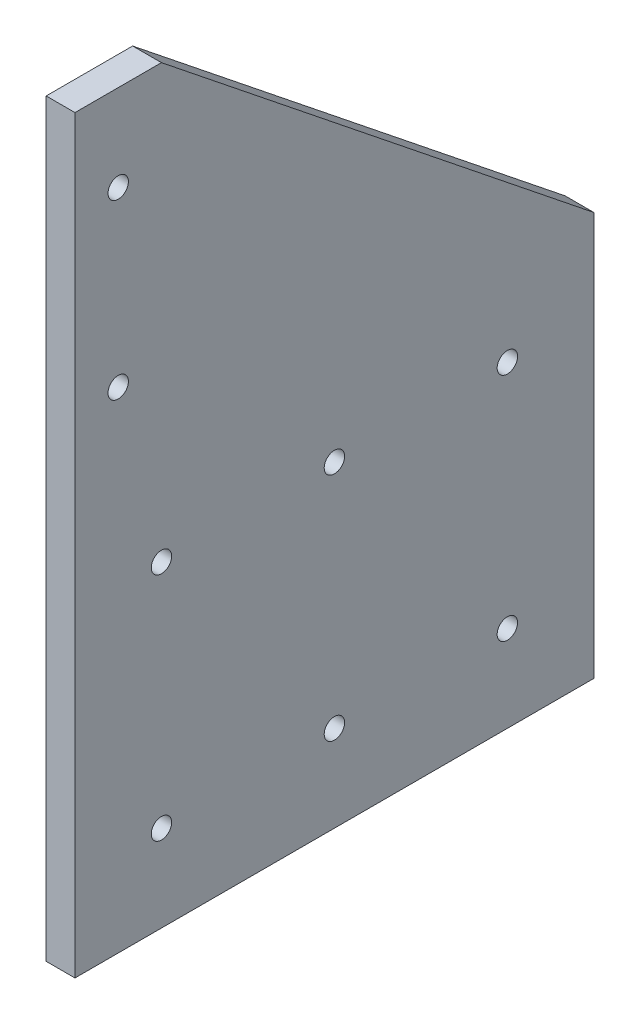
ISO-10303-21;
HEADER;
FILE_DESCRIPTION(('STEP AP214'),'2;1');
FILE_NAME('part.step','',(''),(''),'','','');
FILE_SCHEMA(('AUTOMOTIVE_DESIGN { 1 0 10303 214 1 1 1 1 }'));
ENDSEC;
DATA;
#1=APPLICATION_CONTEXT('core data for automotive mechanical design processes');
#2=APPLICATION_PROTOCOL_DEFINITION('international standard','automotive_design',2000,#1);
#3=PRODUCT_CONTEXT('',#1,'mechanical');
#4=PRODUCT('Part','Part','',(#3));
#5=PRODUCT_RELATED_PRODUCT_CATEGORY('part','',(#4));
#6=PRODUCT_DEFINITION_FORMATION('','',#4);
#7=PRODUCT_DEFINITION_CONTEXT('part definition',#1,'design');
#8=PRODUCT_DEFINITION('design','',#6,#7);
#9=PRODUCT_DEFINITION_SHAPE('','',#8);
#10=(LENGTH_UNIT() NAMED_UNIT(*) SI_UNIT(.MILLI.,.METRE.));
#11=(NAMED_UNIT(*) PLANE_ANGLE_UNIT() SI_UNIT($,.RADIAN.));
#12=(NAMED_UNIT(*) SI_UNIT($,.STERADIAN.) SOLID_ANGLE_UNIT());
#13=UNCERTAINTY_MEASURE_WITH_UNIT(LENGTH_MEASURE(1.E-05),#10,'distance_accuracy_value','');
#14=(GEOMETRIC_REPRESENTATION_CONTEXT(3) GLOBAL_UNCERTAINTY_ASSIGNED_CONTEXT((#13)) GLOBAL_UNIT_ASSIGNED_CONTEXT((#10,
#11,#12)) REPRESENTATION_CONTEXT('',''));
#15=CARTESIAN_POINT('',(0.,0.,0.));
#16=DIRECTION('',(0.,0.,1.));
#17=DIRECTION('',(1.,0.,0.));
#18=AXIS2_PLACEMENT_3D('',#15,#16,#17);
#19=CARTESIAN_POINT('',(6.477,38.1,393.7));
#20=DIRECTION('',(0.,-1.,0.));
#21=DIRECTION('',(0.,0.,-1.));
#22=AXIS2_PLACEMENT_3D('',#19,#20,#21);
#23=PLANE('',#22);
#24=DIRECTION('',(0.,0.,-1.));
#25=VECTOR('',#24,1.);
#26=CARTESIAN_POINT('',(12.827,38.1,393.7));
#27=LINE('',#26,#25);
#28=CARTESIAN_POINT('',(12.827,38.1,412.75));
#29=VERTEX_POINT('',#28);
#30=CARTESIAN_POINT('',(12.827,38.1,393.7));
#31=VERTEX_POINT('',#30);
#32=EDGE_CURVE('E112',#29,#31,#27,.T.);
#33=ORIENTED_EDGE('',*,*,#32,.T.);
#34=DIRECTION('',(1.,0.,0.));
#35=VECTOR('',#34,1.);
#36=CARTESIAN_POINT('',(6.477,38.1,393.7));
#37=LINE('',#36,#35);
#38=CARTESIAN_POINT('',(6.477,38.1,393.7));
#39=VERTEX_POINT('',#38);
#40=EDGE_CURVE('E11',#39,#31,#37,.T.);
#41=ORIENTED_EDGE('',*,*,#40,.F.);
#42=DIRECTION('',(0.,0.,-1.));
#43=VECTOR('',#42,1.);
#44=CARTESIAN_POINT('',(6.477,38.1,393.7));
#45=LINE('',#44,#43);
#46=CARTESIAN_POINT('',(6.477,38.1,412.75));
#47=VERTEX_POINT('',#46);
#48=EDGE_CURVE('E121',#47,#39,#45,.T.);
#49=ORIENTED_EDGE('',*,*,#48,.F.);
#50=DIRECTION('',(1.,0.,0.));
#51=VECTOR('',#50,1.);
#52=CARTESIAN_POINT('',(6.477,38.1,412.75));
#53=LINE('',#52,#51);
#54=EDGE_CURVE('E108',#47,#29,#53,.T.);
#55=ORIENTED_EDGE('',*,*,#54,.T.);
#56=EDGE_LOOP('',(#33,#41,#49,#55));
#57=FACE_BOUND('',#56,.T.);
#58=ADVANCED_FACE('F36',(#57),#23,.F.);
#59=CARTESIAN_POINT('',(6.477,-38.1,298.45));
#60=DIRECTION('',(0.,-0.78086880944303,0.624695047554424));
#61=DIRECTION('',(0.,-0.624695047554424,-0.78086880944303));
#62=AXIS2_PLACEMENT_3D('',#59,#60,#61);
#63=PLANE('',#62);
#64=DIRECTION('',(0.,-0.624695047554424,-0.78086880944303));
#65=VECTOR('',#64,1.);
#66=CARTESIAN_POINT('',(12.827,-38.1,298.45));
#67=LINE('',#66,#65);
#68=CARTESIAN_POINT('',(12.827,-38.1,298.45));
#69=VERTEX_POINT('',#68);
#70=EDGE_CURVE('E115',#31,#69,#67,.T.);
#71=ORIENTED_EDGE('',*,*,#70,.T.);
#72=DIRECTION('',(1.,0.,0.));
#73=VECTOR('',#72,1.);
#74=CARTESIAN_POINT('',(6.477,-38.1,298.45));
#75=LINE('',#74,#73);
#76=CARTESIAN_POINT('',(6.477,-38.1,298.45));
#77=VERTEX_POINT('',#76);
#78=EDGE_CURVE('E45',#77,#69,#75,.T.);
#79=ORIENTED_EDGE('',*,*,#78,.F.);
#80=DIRECTION('',(0.,-0.624695047554424,-0.78086880944303));
#81=VECTOR('',#80,1.);
#82=CARTESIAN_POINT('',(6.477,-38.1,298.45));
#83=LINE('',#82,#81);
#84=EDGE_CURVE('E88',#39,#77,#83,.T.);
#85=ORIENTED_EDGE('',*,*,#84,.F.);
#86=ORIENTED_EDGE('',*,*,#40,.T.);
#87=EDGE_LOOP('',(#71,#79,#85,#86));
#88=FACE_BOUND('',#87,.T.);
#89=ADVANCED_FACE('F195',(#88),#63,.F.);
#90=CARTESIAN_POINT('',(6.477,-127.,298.45));
#91=DIRECTION('',(0.,0.,1.));
#92=DIRECTION('',(1.,0.,0.));
#93=AXIS2_PLACEMENT_3D('',#90,#91,#92);
#94=PLANE('',#93);
#95=DIRECTION('',(0.,-1.,0.));
#96=VECTOR('',#95,1.);
#97=CARTESIAN_POINT('',(12.827,-127.,298.45));
#98=LINE('',#97,#96);
#99=CARTESIAN_POINT('',(12.827,-127.,298.45));
#100=VERTEX_POINT('',#99);
#101=EDGE_CURVE('E103',#69,#100,#98,.T.);
#102=ORIENTED_EDGE('',*,*,#101,.T.);
#103=DIRECTION('',(1.,0.,0.));
#104=VECTOR('',#103,1.);
#105=CARTESIAN_POINT('',(6.477,-127.,298.45));
#106=LINE('',#105,#104);
#107=CARTESIAN_POINT('',(6.477,-127.,298.45));
#108=VERTEX_POINT('',#107);
#109=EDGE_CURVE('E100',#108,#100,#106,.T.);
#110=ORIENTED_EDGE('',*,*,#109,.F.);
#111=DIRECTION('',(0.,-1.,0.));
#112=VECTOR('',#111,1.);
#113=CARTESIAN_POINT('',(6.477,-127.,298.45));
#114=LINE('',#113,#112);
#115=EDGE_CURVE('E92',#77,#108,#114,.T.);
#116=ORIENTED_EDGE('',*,*,#115,.F.);
#117=ORIENTED_EDGE('',*,*,#78,.T.);
#118=EDGE_LOOP('',(#102,#110,#116,#117));
#119=FACE_BOUND('',#118,.T.);
#120=ADVANCED_FACE('F101',(#119),#94,.F.);
#121=CARTESIAN_POINT('',(6.477,-127.,412.75));
#122=DIRECTION('',(0.,1.,0.));
#123=DIRECTION('',(0.,0.,1.));
#124=AXIS2_PLACEMENT_3D('',#121,#122,#123);
#125=PLANE('',#124);
#126=DIRECTION('',(0.,0.,1.));
#127=VECTOR('',#126,1.);
#128=CARTESIAN_POINT('',(12.827,-127.,412.75));
#129=LINE('',#128,#127);
#130=CARTESIAN_POINT('',(12.827,-127.,412.75));
#131=VERTEX_POINT('',#130);
#132=EDGE_CURVE('E74',#100,#131,#129,.T.);
#133=ORIENTED_EDGE('',*,*,#132,.T.);
#134=DIRECTION('',(1.,0.,0.));
#135=VECTOR('',#134,1.);
#136=CARTESIAN_POINT('',(6.477,-127.,412.75));
#137=LINE('',#136,#135);
#138=CARTESIAN_POINT('',(6.477,-127.,412.75));
#139=VERTEX_POINT('',#138);
#140=EDGE_CURVE('E104',#139,#131,#137,.T.);
#141=ORIENTED_EDGE('',*,*,#140,.F.);
#142=DIRECTION('',(0.,0.,1.));
#143=VECTOR('',#142,1.);
#144=CARTESIAN_POINT('',(6.477,-127.,412.75));
#145=LINE('',#144,#143);
#146=EDGE_CURVE('E96',#108,#139,#145,.T.);
#147=ORIENTED_EDGE('',*,*,#146,.F.);
#148=ORIENTED_EDGE('',*,*,#109,.T.);
#149=EDGE_LOOP('',(#133,#141,#147,#148));
#150=FACE_BOUND('',#149,.T.);
#151=ADVANCED_FACE('F106',(#150),#125,.F.);
#152=CARTESIAN_POINT('',(6.477,38.1,412.75));
#153=DIRECTION('',(0.,0.,-1.));
#154=DIRECTION('',(-1.,0.,0.));
#155=AXIS2_PLACEMENT_3D('',#152,#153,#154);
#156=PLANE('',#155);
#157=DIRECTION('',(0.,1.,0.));
#158=VECTOR('',#157,1.);
#159=CARTESIAN_POINT('',(12.827,38.1,412.75));
#160=LINE('',#159,#158);
#161=EDGE_CURVE('E80',#131,#29,#160,.T.);
#162=ORIENTED_EDGE('',*,*,#161,.T.);
#163=ORIENTED_EDGE('',*,*,#54,.F.);
#164=DIRECTION('',(0.,1.,0.));
#165=VECTOR('',#164,1.);
#166=CARTESIAN_POINT('',(6.477,38.1,412.75));
#167=LINE('',#166,#165);
#168=EDGE_CURVE('E54',#139,#47,#167,.T.);
#169=ORIENTED_EDGE('',*,*,#168,.F.);
#170=ORIENTED_EDGE('',*,*,#140,.T.);
#171=EDGE_LOOP('',(#162,#163,#169,#170));
#172=FACE_BOUND('',#171,.T.);
#173=ADVANCED_FACE('F209',(#172),#156,.F.);
#174=CARTESIAN_POINT('',(6.477,0.,0.));
#175=DIRECTION('',(1.,0.,0.));
#176=DIRECTION('',(0.,0.,-1.));
#177=AXIS2_PLACEMENT_3D('',#174,#175,#176);
#178=PLANE('',#177);
#179=CARTESIAN_POINT('',(6.477,19.05,403.225));
#180=DIRECTION('',(-1.,0.,0.));
#181=DIRECTION('',(0.,0.,1.));
#182=AXIS2_PLACEMENT_3D('',#179,#180,#181);
#183=CIRCLE('',#182,4.2164);
#184=CARTESIAN_POINT('',(6.477,19.05,407.4414));
#185=VERTEX_POINT('',#184);
#186=EDGE_CURVE('E404',#185,#185,#183,.T.);
#187=ORIENTED_EDGE('',*,*,#186,.F.);
#188=EDGE_LOOP('',(#187));
#189=FACE_BOUND('',#188,.T.);
#190=CARTESIAN_POINT('',(6.477,-19.05,403.225));
#191=DIRECTION('',(-1.,0.,0.));
#192=DIRECTION('',(0.,0.,1.));
#193=AXIS2_PLACEMENT_3D('',#190,#191,#192);
#194=CIRCLE('',#193,4.2164);
#195=CARTESIAN_POINT('',(6.477,-19.05,407.4414));
#196=VERTEX_POINT('',#195);
#197=EDGE_CURVE('E161',#196,#196,#194,.T.);
#198=ORIENTED_EDGE('',*,*,#197,.F.);
#199=EDGE_LOOP('',(#198));
#200=FACE_BOUND('',#199,.T.);
#201=CARTESIAN_POINT('',(6.477,-57.15,393.7));
#202=DIRECTION('',(-1.,0.,0.));
#203=DIRECTION('',(0.,0.,1.));
#204=AXIS2_PLACEMENT_3D('',#201,#202,#203);
#205=CIRCLE('',#204,4.2164);
#206=CARTESIAN_POINT('',(6.477,-57.15,397.9164));
#207=VERTEX_POINT('',#206);
#208=EDGE_CURVE('E154',#207,#207,#205,.T.);
#209=ORIENTED_EDGE('',*,*,#208,.F.);
#210=EDGE_LOOP('',(#209));
#211=FACE_BOUND('',#210,.T.);
#212=CARTESIAN_POINT('',(6.477,-107.95,393.7));
#213=DIRECTION('',(-1.,0.,0.));
#214=DIRECTION('',(0.,0.,1.));
#215=AXIS2_PLACEMENT_3D('',#212,#213,#214);
#216=CIRCLE('',#215,4.21639999999999);
#217=CARTESIAN_POINT('',(6.477,-107.95,397.9164));
#218=VERTEX_POINT('',#217);
#219=EDGE_CURVE('E150',#218,#218,#216,.T.);
#220=ORIENTED_EDGE('',*,*,#219,.F.);
#221=EDGE_LOOP('',(#220));
#222=FACE_BOUND('',#221,.T.);
#223=CARTESIAN_POINT('',(6.477,-107.95,355.6));
#224=DIRECTION('',(-1.,0.,0.));
#225=DIRECTION('',(0.,0.,1.));
#226=AXIS2_PLACEMENT_3D('',#223,#224,#225);
#227=CIRCLE('',#226,4.21639999999999);
#228=CARTESIAN_POINT('',(6.477,-107.95,359.8164));
#229=VERTEX_POINT('',#228);
#230=EDGE_CURVE('E146',#229,#229,#227,.T.);
#231=ORIENTED_EDGE('',*,*,#230,.F.);
#232=EDGE_LOOP('',(#231));
#233=FACE_BOUND('',#232,.T.);
#234=CARTESIAN_POINT('',(6.477,-57.15,355.6));
#235=DIRECTION('',(-1.,0.,0.));
#236=DIRECTION('',(0.,0.,1.));
#237=AXIS2_PLACEMENT_3D('',#234,#235,#236);
#238=CIRCLE('',#237,4.2164);
#239=CARTESIAN_POINT('',(6.477,-57.15,359.8164));
#240=VERTEX_POINT('',#239);
#241=EDGE_CURVE('E141',#240,#240,#238,.T.);
#242=ORIENTED_EDGE('',*,*,#241,.F.);
#243=EDGE_LOOP('',(#242));
#244=FACE_BOUND('',#243,.T.);
#245=CARTESIAN_POINT('',(6.477,-57.15,317.5));
#246=DIRECTION('',(-1.,0.,0.));
#247=DIRECTION('',(0.,0.,1.));
#248=AXIS2_PLACEMENT_3D('',#245,#246,#247);
#249=CIRCLE('',#248,4.2164);
#250=CARTESIAN_POINT('',(6.477,-57.15,321.7164));
#251=VERTEX_POINT('',#250);
#252=EDGE_CURVE('E136',#251,#251,#249,.T.);
#253=ORIENTED_EDGE('',*,*,#252,.F.);
#254=EDGE_LOOP('',(#253));
#255=FACE_BOUND('',#254,.T.);
#256=CARTESIAN_POINT('',(6.477,-107.95,317.5));
#257=DIRECTION('',(-1.,0.,0.));
#258=DIRECTION('',(0.,0.,1.));
#259=AXIS2_PLACEMENT_3D('',#256,#257,#258);
#260=CIRCLE('',#259,4.21639999999999);
#261=CARTESIAN_POINT('',(6.477,-107.95,321.7164));
#262=VERTEX_POINT('',#261);
#263=EDGE_CURVE('E131',#262,#262,#260,.T.);
#264=ORIENTED_EDGE('',*,*,#263,.F.);
#265=EDGE_LOOP('',(#264));
#266=FACE_BOUND('',#265,.T.);
#267=ORIENTED_EDGE('',*,*,#48,.T.);
#268=ORIENTED_EDGE('',*,*,#84,.T.);
#269=ORIENTED_EDGE('',*,*,#115,.T.);
#270=ORIENTED_EDGE('',*,*,#146,.T.);
#271=ORIENTED_EDGE('',*,*,#168,.T.);
#272=EDGE_LOOP('',(#267,#268,#269,#270,#271));
#273=FACE_BOUND('',#272,.T.);
#274=ADVANCED_FACE('F94',(#189,#200,#211,#222,#233,#244,#255,#266,#273),#178,.F.);
#275=CARTESIAN_POINT('',(12.827,0.,0.));
#276=DIRECTION('',(1.,0.,0.));
#277=DIRECTION('',(0.,0.,-1.));
#278=AXIS2_PLACEMENT_3D('',#275,#276,#277);
#279=PLANE('',#278);
#280=CARTESIAN_POINT('',(12.827,19.05,403.225));
#281=DIRECTION('',(1.,0.,0.));
#282=DIRECTION('',(0.,0.,-1.));
#283=AXIS2_PLACEMENT_3D('',#280,#281,#282);
#284=CIRCLE('',#283,2.2479);
#285=CARTESIAN_POINT('',(12.827,19.05,400.9771));
#286=VERTEX_POINT('',#285);
#287=EDGE_CURVE('E39',#286,#286,#284,.T.);
#288=ORIENTED_EDGE('',*,*,#287,.F.);
#289=EDGE_LOOP('',(#288));
#290=FACE_BOUND('',#289,.T.);
#291=CARTESIAN_POINT('',(12.827,-19.05,403.225));
#292=DIRECTION('',(1.,0.,0.));
#293=DIRECTION('',(0.,0.,-1.));
#294=AXIS2_PLACEMENT_3D('',#291,#292,#293);
#295=CIRCLE('',#294,2.2479);
#296=CARTESIAN_POINT('',(12.827,-19.05,400.9771));
#297=VERTEX_POINT('',#296);
#298=EDGE_CURVE('E152',#297,#297,#295,.T.);
#299=ORIENTED_EDGE('',*,*,#298,.F.);
#300=EDGE_LOOP('',(#299));
#301=FACE_BOUND('',#300,.T.);
#302=CARTESIAN_POINT('',(12.827,-57.15,393.7));
#303=DIRECTION('',(1.,0.,0.));
#304=DIRECTION('',(0.,0.,-1.));
#305=AXIS2_PLACEMENT_3D('',#302,#303,#304);
#306=CIRCLE('',#305,2.2479);
#307=CARTESIAN_POINT('',(12.827,-57.15,391.4521));
#308=VERTEX_POINT('',#307);
#309=EDGE_CURVE('E148',#308,#308,#306,.T.);
#310=ORIENTED_EDGE('',*,*,#309,.F.);
#311=EDGE_LOOP('',(#310));
#312=FACE_BOUND('',#311,.T.);
#313=CARTESIAN_POINT('',(12.827,-107.95,393.7));
#314=DIRECTION('',(1.,0.,0.));
#315=DIRECTION('',(0.,0.,-1.));
#316=AXIS2_PLACEMENT_3D('',#313,#314,#315);
#317=CIRCLE('',#316,2.2479);
#318=CARTESIAN_POINT('',(12.827,-107.95,391.4521));
#319=VERTEX_POINT('',#318);
#320=EDGE_CURVE('E143',#319,#319,#317,.T.);
#321=ORIENTED_EDGE('',*,*,#320,.F.);
#322=EDGE_LOOP('',(#321));
#323=FACE_BOUND('',#322,.T.);
#324=CARTESIAN_POINT('',(12.827,-107.95,355.6));
#325=DIRECTION('',(1.,0.,0.));
#326=DIRECTION('',(0.,0.,-1.));
#327=AXIS2_PLACEMENT_3D('',#324,#325,#326);
#328=CIRCLE('',#327,2.2479);
#329=CARTESIAN_POINT('',(12.827,-107.95,353.3521));
#330=VERTEX_POINT('',#329);
#331=EDGE_CURVE('E138',#330,#330,#328,.T.);
#332=ORIENTED_EDGE('',*,*,#331,.F.);
#333=EDGE_LOOP('',(#332));
#334=FACE_BOUND('',#333,.T.);
#335=CARTESIAN_POINT('',(12.827,-57.15,355.6));
#336=DIRECTION('',(1.,0.,0.));
#337=DIRECTION('',(0.,0.,-1.));
#338=AXIS2_PLACEMENT_3D('',#335,#336,#337);
#339=CIRCLE('',#338,2.2479);
#340=CARTESIAN_POINT('',(12.827,-57.15,353.3521));
#341=VERTEX_POINT('',#340);
#342=EDGE_CURVE('E133',#341,#341,#339,.T.);
#343=ORIENTED_EDGE('',*,*,#342,.F.);
#344=EDGE_LOOP('',(#343));
#345=FACE_BOUND('',#344,.T.);
#346=CARTESIAN_POINT('',(12.827,-57.15,317.5));
#347=DIRECTION('',(1.,0.,0.));
#348=DIRECTION('',(0.,0.,-1.));
#349=AXIS2_PLACEMENT_3D('',#346,#347,#348);
#350=CIRCLE('',#349,2.2479);
#351=CARTESIAN_POINT('',(12.827,-57.15,315.2521));
#352=VERTEX_POINT('',#351);
#353=EDGE_CURVE('E128',#352,#352,#350,.T.);
#354=ORIENTED_EDGE('',*,*,#353,.F.);
#355=EDGE_LOOP('',(#354));
#356=FACE_BOUND('',#355,.T.);
#357=CARTESIAN_POINT('',(12.827,-107.95,317.5));
#358=DIRECTION('',(1.,0.,0.));
#359=DIRECTION('',(0.,0.,-1.));
#360=AXIS2_PLACEMENT_3D('',#357,#358,#359);
#361=CIRCLE('',#360,2.2479);
#362=CARTESIAN_POINT('',(12.827,-107.95,315.2521));
#363=VERTEX_POINT('',#362);
#364=EDGE_CURVE('E116',#363,#363,#361,.T.);
#365=ORIENTED_EDGE('',*,*,#364,.F.);
#366=EDGE_LOOP('',(#365));
#367=FACE_BOUND('',#366,.T.);
#368=ORIENTED_EDGE('',*,*,#32,.F.);
#369=ORIENTED_EDGE('',*,*,#161,.F.);
#370=ORIENTED_EDGE('',*,*,#132,.F.);
#371=ORIENTED_EDGE('',*,*,#101,.F.);
#372=ORIENTED_EDGE('',*,*,#70,.F.);
#373=EDGE_LOOP('',(#368,#369,#370,#371,#372));
#374=FACE_BOUND('',#373,.T.);
#375=ADVANCED_FACE('F197',(#290,#301,#312,#323,#334,#345,#356,#367,#374),#279,.T.);
#376=CARTESIAN_POINT('',(6.477,-107.95,317.5));
#377=DIRECTION('',(-1.,0.,0.));
#378=DIRECTION('',(0.,0.,1.));
#379=AXIS2_PLACEMENT_3D('',#376,#377,#378);
#380=CYLINDRICAL_SURFACE('',#379,2.2479);
#381=ORIENTED_EDGE('',*,*,#364,.T.);
#382=EDGE_LOOP('',(#381));
#383=FACE_BOUND('',#382,.T.);
#384=CARTESIAN_POINT('',(8.12876762397248,-107.95,317.5));
#385=DIRECTION('',(-1.,0.,0.));
#386=DIRECTION('',(0.,0.,1.));
#387=AXIS2_PLACEMENT_3D('',#384,#385,#386);
#388=CIRCLE('',#387,2.2479);
#389=CARTESIAN_POINT('',(8.12876762397248,-107.95,319.7479));
#390=VERTEX_POINT('',#389);
#391=EDGE_CURVE('E127',#390,#390,#388,.T.);
#392=ORIENTED_EDGE('',*,*,#391,.T.);
#393=EDGE_LOOP('',(#392));
#394=FACE_BOUND('',#393,.T.);
#395=ADVANCED_FACE('F199',(#383,#394),#380,.F.);
#396=CARTESIAN_POINT('',(6.477,-107.95,317.5));
#397=DIRECTION('',(-1.,0.,0.));
#398=DIRECTION('',(0.,0.,1.));
#399=AXIS2_PLACEMENT_3D('',#396,#397,#398);
#400=CONICAL_SURFACE('',#399,4.21639999999999,0.872664625997164);
#401=ORIENTED_EDGE('',*,*,#391,.F.);
#402=EDGE_LOOP('',(#401));
#403=FACE_BOUND('',#402,.T.);
#404=ORIENTED_EDGE('',*,*,#263,.T.);
#405=EDGE_LOOP('',(#404));
#406=FACE_BOUND('',#405,.T.);
#407=ADVANCED_FACE('F206',(#403,#406),#400,.F.);
#408=CARTESIAN_POINT('',(6.477,-57.15,317.5));
#409=DIRECTION('',(-1.,0.,0.));
#410=DIRECTION('',(0.,0.,1.));
#411=AXIS2_PLACEMENT_3D('',#408,#409,#410);
#412=CYLINDRICAL_SURFACE('',#411,2.2479);
#413=ORIENTED_EDGE('',*,*,#353,.T.);
#414=EDGE_LOOP('',(#413));
#415=FACE_BOUND('',#414,.T.);
#416=CARTESIAN_POINT('',(8.12876762397248,-57.15,317.5));
#417=DIRECTION('',(-1.,0.,0.));
#418=DIRECTION('',(0.,0.,1.));
#419=AXIS2_PLACEMENT_3D('',#416,#417,#418);
#420=CIRCLE('',#419,2.2479);
#421=CARTESIAN_POINT('',(8.12876762397248,-57.15,319.7479));
#422=VERTEX_POINT('',#421);
#423=EDGE_CURVE('E132',#422,#422,#420,.T.);
#424=ORIENTED_EDGE('',*,*,#423,.T.);
#425=EDGE_LOOP('',(#424));
#426=FACE_BOUND('',#425,.T.);
#427=ADVANCED_FACE('F256',(#415,#426),#412,.F.);
#428=CARTESIAN_POINT('',(6.477,-57.15,317.5));
#429=DIRECTION('',(-1.,0.,0.));
#430=DIRECTION('',(0.,0.,1.));
#431=AXIS2_PLACEMENT_3D('',#428,#429,#430);
#432=CONICAL_SURFACE('',#431,4.2164,0.872664625997166);
#433=ORIENTED_EDGE('',*,*,#423,.F.);
#434=EDGE_LOOP('',(#433));
#435=FACE_BOUND('',#434,.T.);
#436=ORIENTED_EDGE('',*,*,#252,.T.);
#437=EDGE_LOOP('',(#436));
#438=FACE_BOUND('',#437,.T.);
#439=ADVANCED_FACE('F266',(#435,#438),#432,.F.);
#440=CARTESIAN_POINT('',(6.477,-57.15,355.6));
#441=DIRECTION('',(-1.,0.,0.));
#442=DIRECTION('',(0.,0.,1.));
#443=AXIS2_PLACEMENT_3D('',#440,#441,#442);
#444=CYLINDRICAL_SURFACE('',#443,2.2479);
#445=ORIENTED_EDGE('',*,*,#342,.T.);
#446=EDGE_LOOP('',(#445));
#447=FACE_BOUND('',#446,.T.);
#448=CARTESIAN_POINT('',(8.12876762397248,-57.15,355.6));
#449=DIRECTION('',(-1.,0.,0.));
#450=DIRECTION('',(0.,0.,1.));
#451=AXIS2_PLACEMENT_3D('',#448,#449,#450);
#452=CIRCLE('',#451,2.2479);
#453=CARTESIAN_POINT('',(8.12876762397248,-57.15,357.8479));
#454=VERTEX_POINT('',#453);
#455=EDGE_CURVE('E137',#454,#454,#452,.T.);
#456=ORIENTED_EDGE('',*,*,#455,.T.);
#457=EDGE_LOOP('',(#456));
#458=FACE_BOUND('',#457,.T.);
#459=ADVANCED_FACE('F276',(#447,#458),#444,.F.);
#460=CARTESIAN_POINT('',(6.477,-57.15,355.6));
#461=DIRECTION('',(-1.,0.,0.));
#462=DIRECTION('',(0.,0.,1.));
#463=AXIS2_PLACEMENT_3D('',#460,#461,#462);
#464=CONICAL_SURFACE('',#463,4.2164,0.872664625997166);
#465=ORIENTED_EDGE('',*,*,#455,.F.);
#466=EDGE_LOOP('',(#465));
#467=FACE_BOUND('',#466,.T.);
#468=ORIENTED_EDGE('',*,*,#241,.T.);
#469=EDGE_LOOP('',(#468));
#470=FACE_BOUND('',#469,.T.);
#471=ADVANCED_FACE('F286',(#467,#470),#464,.F.);
#472=CARTESIAN_POINT('',(6.477,-107.95,355.6));
#473=DIRECTION('',(-1.,0.,0.));
#474=DIRECTION('',(0.,0.,1.));
#475=AXIS2_PLACEMENT_3D('',#472,#473,#474);
#476=CYLINDRICAL_SURFACE('',#475,2.2479);
#477=ORIENTED_EDGE('',*,*,#331,.T.);
#478=EDGE_LOOP('',(#477));
#479=FACE_BOUND('',#478,.T.);
#480=CARTESIAN_POINT('',(8.12876762397248,-107.95,355.6));
#481=DIRECTION('',(-1.,0.,0.));
#482=DIRECTION('',(0.,0.,1.));
#483=AXIS2_PLACEMENT_3D('',#480,#481,#482);
#484=CIRCLE('',#483,2.2479);
#485=CARTESIAN_POINT('',(8.12876762397248,-107.95,357.8479));
#486=VERTEX_POINT('',#485);
#487=EDGE_CURVE('E142',#486,#486,#484,.T.);
#488=ORIENTED_EDGE('',*,*,#487,.T.);
#489=EDGE_LOOP('',(#488));
#490=FACE_BOUND('',#489,.T.);
#491=ADVANCED_FACE('F296',(#479,#490),#476,.F.);
#492=CARTESIAN_POINT('',(6.477,-107.95,355.6));
#493=DIRECTION('',(-1.,0.,0.));
#494=DIRECTION('',(0.,0.,1.));
#495=AXIS2_PLACEMENT_3D('',#492,#493,#494);
#496=CONICAL_SURFACE('',#495,4.21639999999999,0.872664625997164);
#497=ORIENTED_EDGE('',*,*,#487,.F.);
#498=EDGE_LOOP('',(#497));
#499=FACE_BOUND('',#498,.T.);
#500=ORIENTED_EDGE('',*,*,#230,.T.);
#501=EDGE_LOOP('',(#500));
#502=FACE_BOUND('',#501,.T.);
#503=ADVANCED_FACE('F306',(#499,#502),#496,.F.);
#504=CARTESIAN_POINT('',(6.477,-107.95,393.7));
#505=DIRECTION('',(-1.,0.,0.));
#506=DIRECTION('',(0.,0.,1.));
#507=AXIS2_PLACEMENT_3D('',#504,#505,#506);
#508=CYLINDRICAL_SURFACE('',#507,2.2479);
#509=ORIENTED_EDGE('',*,*,#320,.T.);
#510=EDGE_LOOP('',(#509));
#511=FACE_BOUND('',#510,.T.);
#512=CARTESIAN_POINT('',(8.12876762397248,-107.95,393.7));
#513=DIRECTION('',(-1.,0.,0.));
#514=DIRECTION('',(0.,0.,1.));
#515=AXIS2_PLACEMENT_3D('',#512,#513,#514);
#516=CIRCLE('',#515,2.2479);
#517=CARTESIAN_POINT('',(8.12876762397248,-107.95,395.9479));
#518=VERTEX_POINT('',#517);
#519=EDGE_CURVE('E147',#518,#518,#516,.T.);
#520=ORIENTED_EDGE('',*,*,#519,.T.);
#521=EDGE_LOOP('',(#520));
#522=FACE_BOUND('',#521,.T.);
#523=ADVANCED_FACE('F316',(#511,#522),#508,.F.);
#524=CARTESIAN_POINT('',(6.477,-107.95,393.7));
#525=DIRECTION('',(-1.,0.,0.));
#526=DIRECTION('',(0.,0.,1.));
#527=AXIS2_PLACEMENT_3D('',#524,#525,#526);
#528=CONICAL_SURFACE('',#527,4.21639999999999,0.872664625997164);
#529=ORIENTED_EDGE('',*,*,#519,.F.);
#530=EDGE_LOOP('',(#529));
#531=FACE_BOUND('',#530,.T.);
#532=ORIENTED_EDGE('',*,*,#219,.T.);
#533=EDGE_LOOP('',(#532));
#534=FACE_BOUND('',#533,.T.);
#535=ADVANCED_FACE('F326',(#531,#534),#528,.F.);
#536=CARTESIAN_POINT('',(6.477,-57.15,393.7));
#537=DIRECTION('',(-1.,0.,0.));
#538=DIRECTION('',(0.,0.,1.));
#539=AXIS2_PLACEMENT_3D('',#536,#537,#538);
#540=CYLINDRICAL_SURFACE('',#539,2.2479);
#541=ORIENTED_EDGE('',*,*,#309,.T.);
#542=EDGE_LOOP('',(#541));
#543=FACE_BOUND('',#542,.T.);
#544=CARTESIAN_POINT('',(8.12876762397248,-57.15,393.7));
#545=DIRECTION('',(-1.,0.,0.));
#546=DIRECTION('',(0.,0.,1.));
#547=AXIS2_PLACEMENT_3D('',#544,#545,#546);
#548=CIRCLE('',#547,2.2479);
#549=CARTESIAN_POINT('',(8.12876762397248,-57.15,395.9479));
#550=VERTEX_POINT('',#549);
#551=EDGE_CURVE('E151',#550,#550,#548,.T.);
#552=ORIENTED_EDGE('',*,*,#551,.T.);
#553=EDGE_LOOP('',(#552));
#554=FACE_BOUND('',#553,.T.);
#555=ADVANCED_FACE('F336',(#543,#554),#540,.F.);
#556=CARTESIAN_POINT('',(6.477,-57.15,393.7));
#557=DIRECTION('',(-1.,0.,0.));
#558=DIRECTION('',(0.,0.,1.));
#559=AXIS2_PLACEMENT_3D('',#556,#557,#558);
#560=CONICAL_SURFACE('',#559,4.2164,0.872664625997166);
#561=ORIENTED_EDGE('',*,*,#551,.F.);
#562=EDGE_LOOP('',(#561));
#563=FACE_BOUND('',#562,.T.);
#564=ORIENTED_EDGE('',*,*,#208,.T.);
#565=EDGE_LOOP('',(#564));
#566=FACE_BOUND('',#565,.T.);
#567=ADVANCED_FACE('F346',(#563,#566),#560,.F.);
#568=CARTESIAN_POINT('',(6.477,-19.05,403.225));
#569=DIRECTION('',(-1.,0.,0.));
#570=DIRECTION('',(0.,0.,1.));
#571=AXIS2_PLACEMENT_3D('',#568,#569,#570);
#572=CYLINDRICAL_SURFACE('',#571,2.2479);
#573=ORIENTED_EDGE('',*,*,#298,.T.);
#574=EDGE_LOOP('',(#573));
#575=FACE_BOUND('',#574,.T.);
#576=CARTESIAN_POINT('',(8.12876762397248,-19.05,403.225));
#577=DIRECTION('',(-1.,0.,0.));
#578=DIRECTION('',(0.,0.,1.));
#579=AXIS2_PLACEMENT_3D('',#576,#577,#578);
#580=CIRCLE('',#579,2.2479);
#581=CARTESIAN_POINT('',(8.12876762397248,-19.05,405.4729));
#582=VERTEX_POINT('',#581);
#583=EDGE_CURVE('E155',#582,#582,#580,.T.);
#584=ORIENTED_EDGE('',*,*,#583,.T.);
#585=EDGE_LOOP('',(#584));
#586=FACE_BOUND('',#585,.T.);
#587=ADVANCED_FACE('F356',(#575,#586),#572,.F.);
#588=CARTESIAN_POINT('',(6.477,-19.05,403.225));
#589=DIRECTION('',(-1.,0.,0.));
#590=DIRECTION('',(0.,0.,1.));
#591=AXIS2_PLACEMENT_3D('',#588,#589,#590);
#592=CONICAL_SURFACE('',#591,4.2164,0.872664625997165);
#593=ORIENTED_EDGE('',*,*,#583,.F.);
#594=EDGE_LOOP('',(#593));
#595=FACE_BOUND('',#594,.T.);
#596=ORIENTED_EDGE('',*,*,#197,.T.);
#597=EDGE_LOOP('',(#596));
#598=FACE_BOUND('',#597,.T.);
#599=ADVANCED_FACE('F366',(#595,#598),#592,.F.);
#600=CARTESIAN_POINT('',(6.477,19.05,403.225));
#601=DIRECTION('',(-1.,0.,0.));
#602=DIRECTION('',(0.,0.,1.));
#603=AXIS2_PLACEMENT_3D('',#600,#601,#602);
#604=CYLINDRICAL_SURFACE('',#603,2.2479);
#605=ORIENTED_EDGE('',*,*,#287,.T.);
#606=EDGE_LOOP('',(#605));
#607=FACE_BOUND('',#606,.T.);
#608=CARTESIAN_POINT('',(8.12876762397248,19.05,403.225));
#609=DIRECTION('',(-1.,0.,0.));
#610=DIRECTION('',(0.,0.,1.));
#611=AXIS2_PLACEMENT_3D('',#608,#609,#610);
#612=CIRCLE('',#611,2.2479);
#613=CARTESIAN_POINT('',(8.12876762397248,19.05,405.4729));
#614=VERTEX_POINT('',#613);
#615=EDGE_CURVE('E401',#614,#614,#612,.T.);
#616=ORIENTED_EDGE('',*,*,#615,.T.);
#617=EDGE_LOOP('',(#616));
#618=FACE_BOUND('',#617,.T.);
#619=ADVANCED_FACE('F375',(#607,#618),#604,.F.);
#620=CARTESIAN_POINT('',(6.477,19.05,403.225));
#621=DIRECTION('',(-1.,0.,0.));
#622=DIRECTION('',(0.,0.,1.));
#623=AXIS2_PLACEMENT_3D('',#620,#621,#622);
#624=CONICAL_SURFACE('',#623,4.2164,0.872664625997164);
#625=ORIENTED_EDGE('',*,*,#615,.F.);
#626=EDGE_LOOP('',(#625));
#627=FACE_BOUND('',#626,.T.);
#628=ORIENTED_EDGE('',*,*,#186,.T.);
#629=EDGE_LOOP('',(#628));
#630=FACE_BOUND('',#629,.T.);
#631=ADVANCED_FACE('F385',(#627,#630),#624,.F.);
#632=CLOSED_SHELL('',(#58,#89,#120,#151,#173,#274,#375,#395,#407,#427,#439,#459,#471,#491,#503,
#523,#535,#555,#567,#587,#599,#619,#631));
#633=MANIFOLD_SOLID_BREP('B2',#632);
#634=ADVANCED_BREP_SHAPE_REPRESENTATION('',(#18,#633),#14);
#635=SHAPE_DEFINITION_REPRESENTATION(#9,#634);
ENDSEC;
END-ISO-10303-21;
